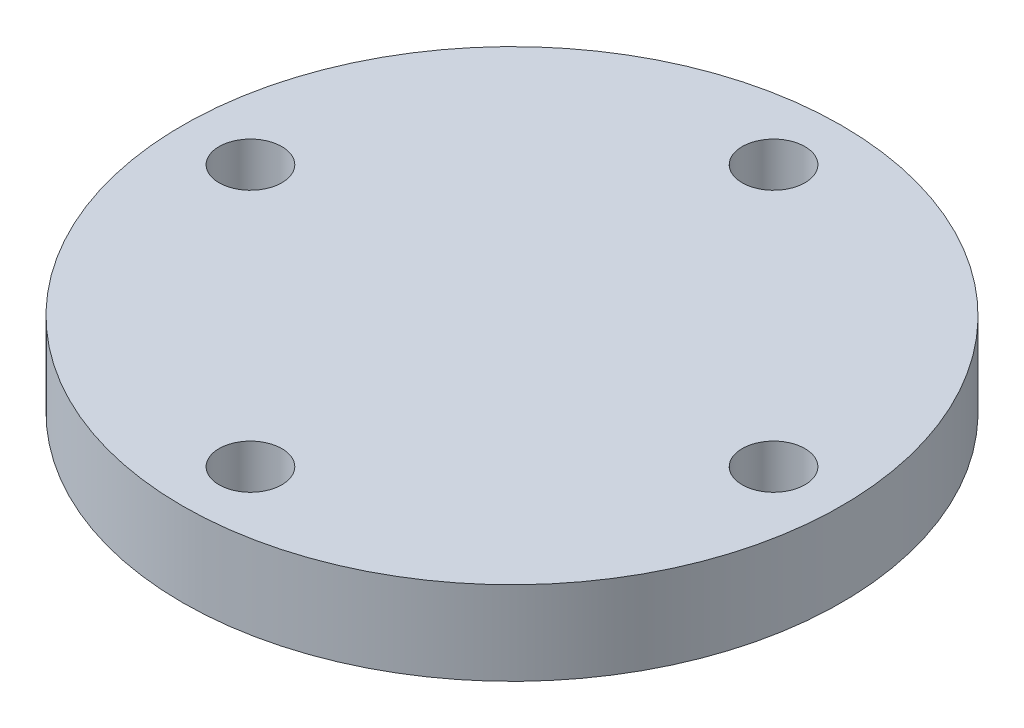
ISO-10303-21;
HEADER;
FILE_DESCRIPTION(('STEP AP214'),'2;1');
FILE_NAME('part.step','',(''),(''),'','','');
FILE_SCHEMA(('AUTOMOTIVE_DESIGN { 1 0 10303 214 1 1 1 1 }'));
ENDSEC;
DATA;
#1=APPLICATION_CONTEXT('core data for automotive mechanical design processes');
#2=APPLICATION_PROTOCOL_DEFINITION('international standard','automotive_design',2000,#1);
#3=PRODUCT_CONTEXT('',#1,'mechanical');
#4=PRODUCT('Part','Part','',(#3));
#5=PRODUCT_RELATED_PRODUCT_CATEGORY('part','',(#4));
#6=PRODUCT_DEFINITION_FORMATION('','',#4);
#7=PRODUCT_DEFINITION_CONTEXT('part definition',#1,'design');
#8=PRODUCT_DEFINITION('design','',#6,#7);
#9=PRODUCT_DEFINITION_SHAPE('','',#8);
#10=(LENGTH_UNIT() NAMED_UNIT(*) SI_UNIT(.MILLI.,.METRE.));
#11=(NAMED_UNIT(*) PLANE_ANGLE_UNIT() SI_UNIT($,.RADIAN.));
#12=(NAMED_UNIT(*) SI_UNIT($,.STERADIAN.) SOLID_ANGLE_UNIT());
#13=UNCERTAINTY_MEASURE_WITH_UNIT(LENGTH_MEASURE(1.E-05),#10,'distance_accuracy_value','');
#14=(GEOMETRIC_REPRESENTATION_CONTEXT(3) GLOBAL_UNCERTAINTY_ASSIGNED_CONTEXT((#13)) GLOBAL_UNIT_ASSIGNED_CONTEXT((#10,
#11,#12)) REPRESENTATION_CONTEXT('',''));
#15=CARTESIAN_POINT('',(0.,0.,0.));
#16=DIRECTION('',(0.,0.,1.));
#17=DIRECTION('',(1.,0.,0.));
#18=AXIS2_PLACEMENT_3D('',#15,#16,#17);
#19=CARTESIAN_POINT('',(0.,8.,0.));
#20=DIRECTION('',(0.,-1.,0.));
#21=DIRECTION('',(0.,0.,-1.));
#22=AXIS2_PLACEMENT_3D('',#19,#20,#21);
#23=CYLINDRICAL_SURFACE('',#22,31.5);
#24=CARTESIAN_POINT('',(0.,8.,0.));
#25=DIRECTION('',(0.,1.,0.));
#26=DIRECTION('',(0.,0.,1.));
#27=AXIS2_PLACEMENT_3D('',#24,#25,#26);
#28=CIRCLE('',#27,31.5);
#29=CARTESIAN_POINT('',(0.,8.,31.5));
#30=VERTEX_POINT('',#29);
#31=EDGE_CURVE('E10',#30,#30,#28,.T.);
#32=ORIENTED_EDGE('',*,*,#31,.F.);
#33=EDGE_LOOP('',(#32));
#34=FACE_BOUND('',#33,.T.);
#35=CARTESIAN_POINT('',(0.,0.,0.));
#36=DIRECTION('',(0.,1.,0.));
#37=DIRECTION('',(0.,0.,1.));
#38=AXIS2_PLACEMENT_3D('',#35,#36,#37);
#39=CIRCLE('',#38,31.5);
#40=CARTESIAN_POINT('',(0.,0.,31.5));
#41=VERTEX_POINT('',#40);
#42=EDGE_CURVE('E35',#41,#41,#39,.T.);
#43=ORIENTED_EDGE('',*,*,#42,.T.);
#44=EDGE_LOOP('',(#43));
#45=FACE_BOUND('',#44,.T.);
#46=ADVANCED_FACE('F32',(#34,#45),#23,.T.);
#47=CARTESIAN_POINT('',(0.,8.,0.));
#48=DIRECTION('',(0.,1.,0.));
#49=DIRECTION('',(0.,0.,1.));
#50=AXIS2_PLACEMENT_3D('',#47,#48,#49);
#51=PLANE('',#50);
#52=CARTESIAN_POINT('',(-25.,8.,0.));
#53=DIRECTION('',(0.,1.,0.));
#54=DIRECTION('',(0.,0.,1.));
#55=AXIS2_PLACEMENT_3D('',#52,#53,#54);
#56=CIRCLE('',#55,3.);
#57=CARTESIAN_POINT('',(-25.,8.,3.));
#58=VERTEX_POINT('',#57);
#59=EDGE_CURVE('E62',#58,#58,#56,.T.);
#60=ORIENTED_EDGE('',*,*,#59,.F.);
#61=EDGE_LOOP('',(#60));
#62=FACE_BOUND('',#61,.T.);
#63=CARTESIAN_POINT('',(0.,8.,25.));
#64=DIRECTION('',(0.,1.,0.));
#65=DIRECTION('',(0.,0.,1.));
#66=AXIS2_PLACEMENT_3D('',#63,#64,#65);
#67=CIRCLE('',#66,3.);
#68=CARTESIAN_POINT('',(0.,8.,28.));
#69=VERTEX_POINT('',#68);
#70=EDGE_CURVE('E56',#69,#69,#67,.T.);
#71=ORIENTED_EDGE('',*,*,#70,.F.);
#72=EDGE_LOOP('',(#71));
#73=FACE_BOUND('',#72,.T.);
#74=CARTESIAN_POINT('',(25.,8.,0.));
#75=DIRECTION('',(0.,1.,0.));
#76=DIRECTION('',(0.,0.,1.));
#77=AXIS2_PLACEMENT_3D('',#74,#75,#76);
#78=CIRCLE('',#77,3.);
#79=CARTESIAN_POINT('',(25.,8.,3.));
#80=VERTEX_POINT('',#79);
#81=EDGE_CURVE('E50',#80,#80,#78,.T.);
#82=ORIENTED_EDGE('',*,*,#81,.F.);
#83=EDGE_LOOP('',(#82));
#84=FACE_BOUND('',#83,.T.);
#85=CARTESIAN_POINT('',(0.,8.,-25.));
#86=DIRECTION('',(0.,1.,0.));
#87=DIRECTION('',(0.,0.,1.));
#88=AXIS2_PLACEMENT_3D('',#85,#86,#87);
#89=CIRCLE('',#88,3.);
#90=CARTESIAN_POINT('',(0.,8.,-22.));
#91=VERTEX_POINT('',#90);
#92=EDGE_CURVE('E44',#91,#91,#89,.T.);
#93=ORIENTED_EDGE('',*,*,#92,.F.);
#94=EDGE_LOOP('',(#93));
#95=FACE_BOUND('',#94,.T.);
#96=ORIENTED_EDGE('',*,*,#31,.T.);
#97=EDGE_LOOP('',(#96));
#98=FACE_BOUND('',#97,.T.);
#99=ADVANCED_FACE('F78',(#62,#73,#84,#95,#98),#51,.T.);
#100=CARTESIAN_POINT('',(0.,0.,0.));
#101=DIRECTION('',(0.,1.,0.));
#102=DIRECTION('',(0.,0.,1.));
#103=AXIS2_PLACEMENT_3D('',#100,#101,#102);
#104=PLANE('',#103);
#105=CARTESIAN_POINT('',(-25.,0.,0.));
#106=DIRECTION('',(0.,1.,0.));
#107=DIRECTION('',(0.,0.,1.));
#108=AXIS2_PLACEMENT_3D('',#105,#106,#107);
#109=CIRCLE('',#108,3.);
#110=CARTESIAN_POINT('',(-25.,0.,3.));
#111=VERTEX_POINT('',#110);
#112=EDGE_CURVE('E47',#111,#111,#109,.T.);
#113=ORIENTED_EDGE('',*,*,#112,.T.);
#114=EDGE_LOOP('',(#113));
#115=FACE_BOUND('',#114,.T.);
#116=CARTESIAN_POINT('',(0.,0.,25.));
#117=DIRECTION('',(0.,1.,0.));
#118=DIRECTION('',(0.,0.,1.));
#119=AXIS2_PLACEMENT_3D('',#116,#117,#118);
#120=CIRCLE('',#119,3.);
#121=CARTESIAN_POINT('',(0.,0.,28.));
#122=VERTEX_POINT('',#121);
#123=EDGE_CURVE('E59',#122,#122,#120,.T.);
#124=ORIENTED_EDGE('',*,*,#123,.T.);
#125=EDGE_LOOP('',(#124));
#126=FACE_BOUND('',#125,.T.);
#127=CARTESIAN_POINT('',(25.,0.,0.));
#128=DIRECTION('',(0.,1.,0.));
#129=DIRECTION('',(0.,0.,1.));
#130=AXIS2_PLACEMENT_3D('',#127,#128,#129);
#131=CIRCLE('',#130,3.);
#132=CARTESIAN_POINT('',(25.,0.,3.));
#133=VERTEX_POINT('',#132);
#134=EDGE_CURVE('E53',#133,#133,#131,.T.);
#135=ORIENTED_EDGE('',*,*,#134,.T.);
#136=EDGE_LOOP('',(#135));
#137=FACE_BOUND('',#136,.T.);
#138=CARTESIAN_POINT('',(0.,0.,-25.));
#139=DIRECTION('',(0.,1.,0.));
#140=DIRECTION('',(0.,0.,1.));
#141=AXIS2_PLACEMENT_3D('',#138,#139,#140);
#142=CIRCLE('',#141,3.);
#143=CARTESIAN_POINT('',(0.,0.,-22.));
#144=VERTEX_POINT('',#143);
#145=EDGE_CURVE('E42',#144,#144,#142,.T.);
#146=ORIENTED_EDGE('',*,*,#145,.T.);
#147=EDGE_LOOP('',(#146));
#148=FACE_BOUND('',#147,.T.);
#149=ORIENTED_EDGE('',*,*,#42,.F.);
#150=EDGE_LOOP('',(#149));
#151=FACE_BOUND('',#150,.T.);
#152=ADVANCED_FACE('F68',(#115,#126,#137,#148,#151),#104,.F.);
#153=CARTESIAN_POINT('',(0.,0.,-25.));
#154=DIRECTION('',(0.,1.,0.));
#155=DIRECTION('',(0.,0.,1.));
#156=AXIS2_PLACEMENT_3D('',#153,#154,#155);
#157=CYLINDRICAL_SURFACE('',#156,3.);
#158=ORIENTED_EDGE('',*,*,#145,.F.);
#159=EDGE_LOOP('',(#158));
#160=FACE_BOUND('',#159,.T.);
#161=ORIENTED_EDGE('',*,*,#92,.T.);
#162=EDGE_LOOP('',(#161));
#163=FACE_BOUND('',#162,.T.);
#164=ADVANCED_FACE('F88',(#160,#163),#157,.F.);
#165=CARTESIAN_POINT('',(25.,0.,0.));
#166=DIRECTION('',(0.,1.,0.));
#167=DIRECTION('',(0.,0.,1.));
#168=AXIS2_PLACEMENT_3D('',#165,#166,#167);
#169=CYLINDRICAL_SURFACE('',#168,3.);
#170=ORIENTED_EDGE('',*,*,#134,.F.);
#171=EDGE_LOOP('',(#170));
#172=FACE_BOUND('',#171,.T.);
#173=ORIENTED_EDGE('',*,*,#81,.T.);
#174=EDGE_LOOP('',(#173));
#175=FACE_BOUND('',#174,.T.);
#176=ADVANCED_FACE('F90',(#172,#175),#169,.F.);
#177=CARTESIAN_POINT('',(0.,0.,25.));
#178=DIRECTION('',(0.,1.,0.));
#179=DIRECTION('',(0.,0.,1.));
#180=AXIS2_PLACEMENT_3D('',#177,#178,#179);
#181=CYLINDRICAL_SURFACE('',#180,3.);
#182=ORIENTED_EDGE('',*,*,#123,.F.);
#183=EDGE_LOOP('',(#182));
#184=FACE_BOUND('',#183,.T.);
#185=ORIENTED_EDGE('',*,*,#70,.T.);
#186=EDGE_LOOP('',(#185));
#187=FACE_BOUND('',#186,.T.);
#188=ADVANCED_FACE('F74',(#184,#187),#181,.F.);
#189=CARTESIAN_POINT('',(-25.,0.,0.));
#190=DIRECTION('',(0.,1.,0.));
#191=DIRECTION('',(0.,0.,1.));
#192=AXIS2_PLACEMENT_3D('',#189,#190,#191);
#193=CYLINDRICAL_SURFACE('',#192,3.);
#194=ORIENTED_EDGE('',*,*,#112,.F.);
#195=EDGE_LOOP('',(#194));
#196=FACE_BOUND('',#195,.T.);
#197=ORIENTED_EDGE('',*,*,#59,.T.);
#198=EDGE_LOOP('',(#197));
#199=FACE_BOUND('',#198,.T.);
#200=ADVANCED_FACE('F71',(#196,#199),#193,.F.);
#201=CLOSED_SHELL('',(#46,#99,#152,#164,#176,#188,#200));
#202=MANIFOLD_SOLID_BREP('B2',#201);
#203=ADVANCED_BREP_SHAPE_REPRESENTATION('',(#18,#202),#14);
#204=SHAPE_DEFINITION_REPRESENTATION(#9,#203);
ENDSEC;
END-ISO-10303-21;
